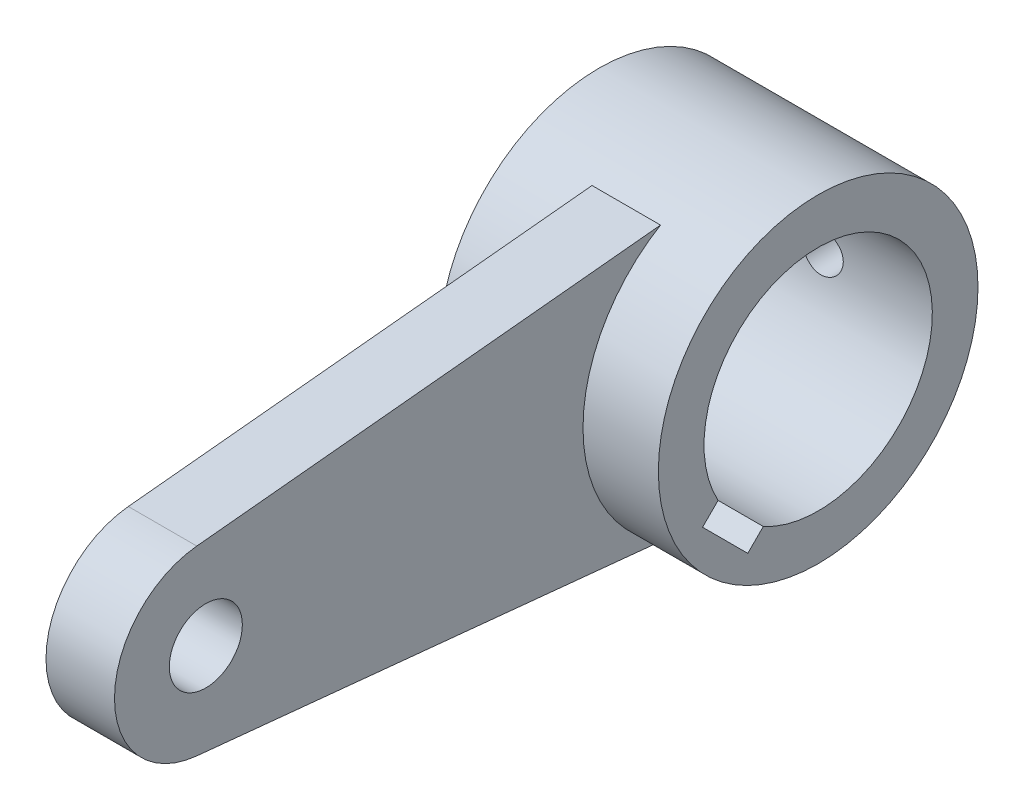
ISO-10303-21;
HEADER;
FILE_DESCRIPTION(('STEP AP214'),'2;1');
FILE_NAME('part.step','',(''),(''),'','','');
FILE_SCHEMA(('AUTOMOTIVE_DESIGN { 1 0 10303 214 1 1 1 1 }'));
ENDSEC;
DATA;
#1=APPLICATION_CONTEXT('core data for automotive mechanical design processes');
#2=APPLICATION_PROTOCOL_DEFINITION('international standard','automotive_design',2000,#1);
#3=PRODUCT_CONTEXT('',#1,'mechanical');
#4=PRODUCT('Part','Part','',(#3));
#5=PRODUCT_RELATED_PRODUCT_CATEGORY('part','',(#4));
#6=PRODUCT_DEFINITION_FORMATION('','',#4);
#7=PRODUCT_DEFINITION_CONTEXT('part definition',#1,'design');
#8=PRODUCT_DEFINITION('design','',#6,#7);
#9=PRODUCT_DEFINITION_SHAPE('','',#8);
#10=(LENGTH_UNIT() NAMED_UNIT(*) SI_UNIT(.MILLI.,.METRE.));
#11=(NAMED_UNIT(*) PLANE_ANGLE_UNIT() SI_UNIT($,.RADIAN.));
#12=(NAMED_UNIT(*) SI_UNIT($,.STERADIAN.) SOLID_ANGLE_UNIT());
#13=UNCERTAINTY_MEASURE_WITH_UNIT(LENGTH_MEASURE(1.E-05),#10,'distance_accuracy_value','');
#14=(GEOMETRIC_REPRESENTATION_CONTEXT(3) GLOBAL_UNCERTAINTY_ASSIGNED_CONTEXT((#13)) GLOBAL_UNIT_ASSIGNED_CONTEXT((#10,
#11,#12)) REPRESENTATION_CONTEXT('',''));
#15=CARTESIAN_POINT('',(0.,0.,0.));
#16=DIRECTION('',(0.,0.,1.));
#17=DIRECTION('',(1.,0.,0.));
#18=AXIS2_PLACEMENT_3D('',#15,#16,#17);
#19=CARTESIAN_POINT('',(24.,-1.66533453693773E-13,0.));
#20=DIRECTION('',(-1.,0.,0.));
#21=DIRECTION('',(0.,0.,1.00000000000001));
#22=AXIS2_PLACEMENT_3D('',#19,#20,#21);
#23=CYLINDRICAL_SURFACE('',#22,35.);
#24=DIRECTION('',(-1.,0.,0.));
#25=VECTOR('',#24,1.);
#26=CARTESIAN_POINT('',(7.50000000000006,30.0000000000002,18.0277563773201));
#27=LINE('',#26,#25);
#28=CARTESIAN_POINT('',(7.50000000000006,30.0000000000002,18.0277563773201));
#29=VERTEX_POINT('',#28);
#30=CARTESIAN_POINT('',(-7.50000000000006,30.,18.0277563773202));
#31=VERTEX_POINT('',#30);
#32=EDGE_CURVE('E63',#29,#31,#27,.T.);
#33=ORIENTED_EDGE('',*,*,#32,.F.);
#34=CARTESIAN_POINT('',(7.50000000000006,-1.11022302462516E-13,0.));
#35=DIRECTION('',(-1.,0.,0.));
#36=DIRECTION('',(0.,0.,-1.00000000000001));
#37=AXIS2_PLACEMENT_3D('',#34,#35,#36);
#38=CIRCLE('',#37,35.);
#39=CARTESIAN_POINT('',(7.50000000000006,-30.0000000000003,18.0277563773201));
#40=VERTEX_POINT('',#39);
#41=EDGE_CURVE('E145',#40,#29,#38,.T.);
#42=ORIENTED_EDGE('',*,*,#41,.F.);
#43=DIRECTION('',(-1.,0.,0.));
#44=VECTOR('',#43,1.);
#45=CARTESIAN_POINT('',(7.50000000000006,-30.0000000000003,18.0277563773201));
#46=LINE('',#45,#44);
#47=CARTESIAN_POINT('',(-7.50000000000006,-30.0000000000001,18.0277563773202));
#48=VERTEX_POINT('',#47);
#49=EDGE_CURVE('E156',#40,#48,#46,.T.);
#50=ORIENTED_EDGE('',*,*,#49,.T.);
#51=CARTESIAN_POINT('',(-7.50000000000006,0.,0.));
#52=DIRECTION('',(-1.,0.,0.));
#53=DIRECTION('',(0.,0.,-1.00000000000001));
#54=AXIS2_PLACEMENT_3D('',#51,#52,#53);
#55=CIRCLE('',#54,35.);
#56=EDGE_CURVE('E142',#48,#31,#55,.T.);
#57=ORIENTED_EDGE('',*,*,#56,.T.);
#58=EDGE_LOOP('',(#33,#42,#50,#57));
#59=FACE_BOUND('',#58,.T.);
#60=CARTESIAN_POINT('',(24.,-1.66533453693773E-13,0.));
#61=DIRECTION('',(1.,0.,0.));
#62=DIRECTION('',(0.,0.,-1.00000000000001));
#63=AXIS2_PLACEMENT_3D('',#60,#61,#62);
#64=CIRCLE('',#63,35.);
#65=CARTESIAN_POINT('',(24.,-1.65562008547226E-13,-35.0000000000002));
#66=VERTEX_POINT('',#65);
#67=EDGE_CURVE('E177',#66,#66,#64,.T.);
#68=ORIENTED_EDGE('',*,*,#67,.F.);
#69=EDGE_LOOP('',(#68));
#70=FACE_BOUND('',#69,.T.);
#71=CARTESIAN_POINT('',(-24.,0.,0.));
#72=DIRECTION('',(1.,0.,0.));
#73=DIRECTION('',(0.,0.,-1.00000000000001));
#74=AXIS2_PLACEMENT_3D('',#71,#72,#73);
#75=CIRCLE('',#74,35.);
#76=CARTESIAN_POINT('',(-24.,0.,-35.0000000000002));
#77=VERTEX_POINT('',#76);
#78=EDGE_CURVE('E175',#77,#77,#75,.T.);
#79=ORIENTED_EDGE('',*,*,#78,.T.);
#80=EDGE_LOOP('',(#79));
#81=FACE_BOUND('',#80,.T.);
#82=CARTESIAN_POINT('',(-4.49999999999995,-3.33066907387547E-13,-35.0000000000001));
#83=CARTESIAN_POINT('',(-4.49998934626575,0.251653327872403,-34.9999964079494));
#84=CARTESIAN_POINT('',(-4.47881901313681,0.503462432880817,-34.9972572476564));
#85=CARTESIAN_POINT('',(-4.39470294313481,1.00006950608812,-34.9865936899741));
#86=CARTESIAN_POINT('',(-4.33171397409341,1.24485994489291,-34.978663926651));
#87=CARTESIAN_POINT('',(-4.16585068292742,1.72016871583605,-34.9585122034243));
#88=CARTESIAN_POINT('',(-4.06300364644997,1.95069668671067,-34.9462931803585));
#89=CARTESIAN_POINT('',(-3.8204043124335,2.39117836341503,-34.9189207749941));
#90=CARTESIAN_POINT('',(-3.68065818529258,2.60113550113225,-34.9037678834205));
#91=CARTESIAN_POINT('',(-3.36735984834219,2.9957782427564,-34.8721202031521));
#92=CARTESIAN_POINT('',(-3.19363599493925,3.1803270707991,-34.8556188598466));
#93=CARTESIAN_POINT('',(-2.81768227222749,3.51773628297806,-34.8231867224519));
#94=CARTESIAN_POINT('',(-2.61545092759514,3.67059502607258,-34.8072559579451));
#95=CARTESIAN_POINT('',(-2.18732976956002,3.94079764224661,-34.7777043595065));
#96=CARTESIAN_POINT('',(-1.96135807855393,4.05801278848318,-34.7640919744397));
#97=CARTESIAN_POINT('',(-1.49273282489478,4.25277875211245,-34.7408052922164));
#98=CARTESIAN_POINT('',(-1.25007993126687,4.33033115918836,-34.7311308372308));
#99=CARTESIAN_POINT('',(-0.756402638544772,4.44315330658766,-34.716878277897));
#100=CARTESIAN_POINT('',(-0.50543194558499,4.4786544653308,-34.7122722905706));
#101=CARTESIAN_POINT('',(-0.00105596789795544,4.50708256587183,-34.7085929456662));
#102=CARTESIAN_POINT('',(0.252349212979716,4.5000113157291,-34.7095193531262));
#103=CARTESIAN_POINT('',(0.752785247513631,4.44368517865505,-34.7167746091795));
#104=CARTESIAN_POINT('',(0.999845376275211,4.39468557875236,-34.7230707625071));
#105=CARTESIAN_POINT('',(1.48220708776003,4.25629214436951,-34.7403050878774));
#106=CARTESIAN_POINT('',(1.7175084195286,4.16689744819116,-34.7512433589442));
#107=CARTESIAN_POINT('',(2.17046410907089,3.94997819255534,-34.7765663978875));
#108=CARTESIAN_POINT('',(2.38806493736818,3.82234306789773,-34.7909611352105));
#109=CARTESIAN_POINT('',(2.7988560298196,3.53264509529936,-34.8215675443457));
#110=CARTESIAN_POINT('',(2.9920451123774,3.37058058189771,-34.8377793040352));
#111=CARTESIAN_POINT('',(3.3500102646726,3.01521121875477,-34.870338327066));
#112=CARTESIAN_POINT('',(3.51456802498349,2.8216863969924,-34.8866857137117));
#113=CARTESIAN_POINT('',(3.80889828104401,2.40964625009522,-34.9175631452331));
#114=CARTESIAN_POINT('',(3.93867068845786,2.19113086150006,-34.9320931854937));
#115=CARTESIAN_POINT('',(4.15974809240745,1.73514132152119,-34.9577085505708));
#116=CARTESIAN_POINT('',(4.25103900112678,1.49766026471358,-34.9687926134493));
#117=CARTESIAN_POINT('',(4.39238652013332,1.01056525528227,-34.986255844504));
#118=CARTESIAN_POINT('',(4.44244517345161,0.760951904454844,-34.9926352457915));
#119=CARTESIAN_POINT('',(4.4996232857792,0.258565063455578,-34.9999399922945));
#120=CARTESIAN_POINT('',(4.50704339651776,0.00582632488153038,-35.0009035246809));
#121=CARTESIAN_POINT('',(4.47952782522866,-0.497291152296377,-34.9973711849401));
#122=CARTESIAN_POINT('',(4.44459309873939,-0.747669944012954,-34.9928754359761));
#123=CARTESIAN_POINT('',(4.33360932491524,-1.23806995443231,-34.9789534490072));
#124=CARTESIAN_POINT('',(4.25770404518851,-1.47812424084549,-34.9695444555461));
#125=CARTESIAN_POINT('',(4.06708358974661,-1.94209663413517,-34.9468491097887));
#126=CARTESIAN_POINT('',(3.95236702711579,-2.16601416402005,-34.9335626189329));
#127=CARTESIAN_POINT('',(3.68665590111389,-2.59269685534762,-34.9044977168871));
#128=CARTESIAN_POINT('',(3.53546735311593,-2.79534030307811,-34.8887061410242));
#129=CARTESIAN_POINT('',(3.20137779872807,-3.17248320306732,-34.8564376514751));
#130=CARTESIAN_POINT('',(3.01847545768736,-3.34698147026079,-34.8399607089677));
#131=CARTESIAN_POINT('',(2.62482397817248,-3.66395097341646,-34.8080602827341));
#132=CARTESIAN_POINT('',(2.4139134749398,-3.80622260959342,-34.7926437553188));
#133=CARTESIAN_POINT('',(1.97101366598868,-4.05332025045468,-34.7647252726913));
#134=CARTESIAN_POINT('',(1.73902480343612,-4.15814704217663,-34.752223256222));
#135=CARTESIAN_POINT('',(1.26119114696489,-4.32705800869408,-34.7315971267896));
#136=CARTESIAN_POINT('',(1.01538632144946,-4.3912537253473,-34.7234610377672));
#137=CARTESIAN_POINT('',(0.516374156230169,-4.47743895394378,-34.7124539507529));
#138=CARTESIAN_POINT('',(0.263167183151895,-4.4994305526575,-34.7095826924432));
#139=CARTESIAN_POINT('',(-0.241475469606281,-4.50054349543279,-34.7094382399855));
#140=CARTESIAN_POINT('',(-0.492910503368095,-4.47997844331771,-34.7121240949414));
#141=CARTESIAN_POINT('',(-0.988718228071383,-4.39722698982336,-34.7227030727448));
#142=CARTESIAN_POINT('',(-1.23309091964491,-4.33504059216907,-34.7305961951262));
#143=CARTESIAN_POINT('',(-1.70778976267331,-4.17091148969104,-34.750687466182));
#144=CARTESIAN_POINT('',(-1.93812153088628,-4.06898480437313,-34.7628838799905));
#145=CARTESIAN_POINT('',(-2.37846324003053,-3.82829928040281,-34.7902102580458));
#146=CARTESIAN_POINT('',(-2.58847286808922,-3.68953987480971,-34.8053402674465));
#147=CARTESIAN_POINT('',(-2.98381083182371,-3.37796728972685,-34.836962557244));
#148=CARTESIAN_POINT('',(-3.16895438482945,-3.20492053127879,-34.8534637038449));
#149=CARTESIAN_POINT('',(-3.5076938811061,-2.83017416001607,-34.8858912690296));
#150=CARTESIAN_POINT('',(-3.66128239212985,-2.62846781580981,-34.9018175514877));
#151=CARTESIAN_POINT('',(-3.93308173949245,-2.20119414278173,-34.9313720206137));
#152=CARTESIAN_POINT('',(-4.05114792210661,-1.97553418075075,-34.9449907146481));
#153=CARTESIAN_POINT('',(-4.2475391338936,-1.50753822284314,-34.9682999183416));
#154=CARTESIAN_POINT('',(-4.32590708039909,-1.26522055880244,-34.9779946678449));
#155=CARTESIAN_POINT('',(-4.42204672994424,-0.851391856056923,-34.9900428659329));
#156=CARTESIAN_POINT('',(-4.45123684801208,-0.682483721368915,-34.993758471601));
#157=CARTESIAN_POINT('',(-4.49021703046482,-0.342407755364722,-34.9987382509905));
#158=CARTESIAN_POINT('',(-4.50000724943648,-0.171239942065571,-35.0000024442458));
#159=CARTESIAN_POINT('',(-4.49999999999995,-3.33066907387547E-13,-35.0000000000001));
#160=B_SPLINE_CURVE_WITH_KNOTS('',3,(#82,#83,#84,#85,#86,#87,#88,#89,#90,#91,#92,#93,#94,#95,
#96,#97,#98,#99,#100,#101,#102,#103,#104,#105,#106,#107,#108,#109,#110,#111,#112,#113,#114,#115,
#116,#117,#118,#119,#120,#121,#122,#123,#124,#125,#126,#127,#128,#129,#130,#131,#132,#133,#134,
#135,#136,#137,#138,#139,#140,#141,#142,#143,#144,#145,#146,#147,#148,#149,#150,#151,#152,#153,
#154,#155,#156,#157,#158,#159),.UNSPECIFIED.,.T.,.F.,(4,2,2,2,2,2,2,2,2,2,2,2,2,2,2,2,2,2,2,2,2,
2,2,2,2,2,2,2,2,2,2,2,2,2,2,2,2,2,4),(0.,0.754334466877883,1.50944998270762,2.26404947944321,
3.01852286917677,3.77691090876911,4.53533821098032,5.29647290364948,6.05757708763706,
6.814472973727,7.57133671451225,8.3236247028369,9.07592873954035,9.83042926827081,
10.5849663029457,11.3450259361697,12.105087499511,12.8654270750951,13.6257289740878,
14.3806632115076,15.1355804176915,15.8878656438591,16.6401777556719,17.396583029077,
18.1530201429511,18.9140214951897,19.675006851315,20.4338939575413,21.192743539846,
21.9460210087599,22.6992984102579,23.4522724753418,24.2052581311086,24.9635616389129,
25.7220435478212,26.4835735890398,27.2442785819027,27.7575768593779,28.2708710466549),.UNSPECIFIED.);
#161=CARTESIAN_POINT('',(-4.49999999999995,-3.33066907387547E-13,-35.0000000000001));
#162=VERTEX_POINT('',#161);
#163=EDGE_CURVE('E129',#162,#162,#160,.T.);
#164=ORIENTED_EDGE('',*,*,#163,.F.);
#165=EDGE_LOOP('',(#164));
#166=FACE_BOUND('',#165,.T.);
#167=ADVANCED_FACE('F34',(#59,#70,#81,#166),#23,.T.);
#168=CARTESIAN_POINT('',(24.,-1.66533453693773E-13,0.));
#169=DIRECTION('',(-1.,0.,0.));
#170=DIRECTION('',(0.,0.,1.00000000000001));
#171=AXIS2_PLACEMENT_3D('',#168,#169,#170);
#172=CYLINDRICAL_SURFACE('',#171,25.);
#173=DIRECTION('',(-1.,0.,0.));
#174=VECTOR('',#173,1.);
#175=CARTESIAN_POINT('',(24.,-21.920310216783,12.0208152801715));
#176=LINE('',#175,#174);
#177=CARTESIAN_POINT('',(24.,-21.920310216783,12.0208152801715));
#178=VERTEX_POINT('',#177);
#179=CARTESIAN_POINT('',(-24.,-21.920310216783,12.0208152801715));
#180=VERTEX_POINT('',#179);
#181=EDGE_CURVE('E11',#178,#180,#176,.T.);
#182=ORIENTED_EDGE('',*,*,#181,.F.);
#183=CARTESIAN_POINT('',(24.,-1.66533453693773E-13,0.));
#184=DIRECTION('',(1.,0.,0.));
#185=DIRECTION('',(0.,0.,-1.00000000000001));
#186=AXIS2_PLACEMENT_3D('',#183,#184,#185);
#187=CIRCLE('',#186,25.);
#188=CARTESIAN_POINT('',(24.,-12.0208152801716,21.9203102167833));
#189=VERTEX_POINT('',#188);
#190=EDGE_CURVE('E172',#178,#189,#187,.T.);
#191=ORIENTED_EDGE('',*,*,#190,.T.);
#192=DIRECTION('',(-1.,0.,0.));
#193=VECTOR('',#192,1.);
#194=CARTESIAN_POINT('',(24.,-12.0208152801716,21.9203102167831));
#195=LINE('',#194,#193);
#196=CARTESIAN_POINT('',(-24.,-12.0208152801716,21.920310216783));
#197=VERTEX_POINT('',#196);
#198=EDGE_CURVE('E48',#197,#189,#195,.F.);
#199=ORIENTED_EDGE('',*,*,#198,.F.);
#200=CARTESIAN_POINT('',(-24.,0.,0.));
#201=DIRECTION('',(1.,0.,0.));
#202=DIRECTION('',(0.,0.,-1.00000000000001));
#203=AXIS2_PLACEMENT_3D('',#200,#201,#202);
#204=CIRCLE('',#203,25.);
#205=EDGE_CURVE('E123',#180,#197,#204,.T.);
#206=ORIENTED_EDGE('',*,*,#205,.F.);
#207=EDGE_LOOP('',(#182,#191,#199,#206));
#208=FACE_BOUND('',#207,.T.);
#209=CARTESIAN_POINT('',(-4.49999999999995,-1.11022302462516E-13,-25.0000000000002));
#210=CARTESIAN_POINT('',(-4.49999023794716,0.250597363973489,-24.9999955349826));
#211=CARTESIAN_POINT('',(-4.47899625537841,0.501323876917068,-24.9961930246658));
#212=CARTESIAN_POINT('',(-4.39562192968992,0.995723957330716,-24.9813904308184));
#213=CARTESIAN_POINT('',(-4.3332054899994,1.2393911797038,-24.9703840697864));
#214=CARTESIAN_POINT('',(-4.16894916310296,1.71244999616215,-24.9424062116719));
#215=CARTESIAN_POINT('',(-4.06714363575237,1.94185383059238,-24.9254399147402));
#216=CARTESIAN_POINT('',(-3.82709380352831,2.38030017518667,-24.8873996423389));
#217=CARTESIAN_POINT('',(-3.6888528990225,2.58934458292242,-24.8663260502345));
#218=CARTESIAN_POINT('',(-3.37822968752513,2.9834778410402,-24.822139967987));
#219=CARTESIAN_POINT('',(-3.20552232290175,3.16830850004184,-24.7990093268507));
#220=CARTESIAN_POINT('',(-2.83156816138718,3.50653520488889,-24.7534523836024));
#221=CARTESIAN_POINT('',(-2.63031941200503,3.65992909841612,-24.7310261298053));
#222=CARTESIAN_POINT('',(-2.20318937983305,3.93198738992529,-24.6892410288133));
#223=CARTESIAN_POINT('',(-1.97714004226102,4.05039185622169,-24.6699056064478));
#224=CARTESIAN_POINT('',(-1.50795273724956,4.2474469178391,-24.6367457883013));
#225=CARTESIAN_POINT('',(-1.26481612489629,4.32610066150116,-24.6229209560884));
#226=CARTESIAN_POINT('',(-0.771109385193369,4.44059853206696,-24.6025296249145));
#227=CARTESIAN_POINT('',(-0.520646504029415,4.47689129643552,-24.5958871157589));
#228=CARTESIAN_POINT('',(-0.0171050046734491,4.50702896793608,-24.5903830912277));
#229=CARTESIAN_POINT('',(0.235973395787819,4.50087738040679,-24.5915209332985));
#230=CARTESIAN_POINT('',(0.734329570898128,4.44666536597973,-24.6013797705315));
#231=CARTESIAN_POINT('',(0.979664673316047,4.39911277131175,-24.6100088728768));
#232=CARTESIAN_POINT('',(1.45881687055286,4.26424730205563,-24.63373379911));
#233=CARTESIAN_POINT('',(1.69263351048957,4.17693285860228,-24.648829878161));
#234=CARTESIAN_POINT('',(2.1436102862432,3.96451882360117,-24.6838850704584));
#235=CARTESIAN_POINT('',(2.36067067050965,3.83921201164635,-24.7038707343534));
#236=CARTESIAN_POINT('',(2.7708760062849,3.55451700057589,-24.7464353447751));
#237=CARTESIAN_POINT('',(2.9640187125665,3.39512560565782,-24.7690145343812));
#238=CARTESIAN_POINT('',(3.32384227379375,3.04403715860629,-24.8146237678445));
#239=CARTESIAN_POINT('',(3.49009887265454,2.85190522880319,-24.8376556021254));
#240=CARTESIAN_POINT('',(3.78808180669693,2.44225060557953,-24.881273529755));
#241=CARTESIAN_POINT('',(3.91980784519202,2.22472769402289,-24.9018596020889));
#242=CARTESIAN_POINT('',(4.1450439712581,1.77003953774171,-24.9383032656861));
#243=CARTESIAN_POINT('',(4.23851241690934,1.53285322593546,-24.9541556995184));
#244=CARTESIAN_POINT('',(4.38416438602455,1.04579850607948,-24.9793055791381));
#245=CARTESIAN_POINT('',(4.4363519462577,0.795931340606729,-24.9886036658513));
#246=CARTESIAN_POINT('',(4.49737595980626,0.294260216988724,-24.9995098648127));
#247=CARTESIAN_POINT('',(4.50679412042046,0.0425291868627092,-25.0012211575047));
#248=CARTESIAN_POINT('',(4.48356880794404,-0.458911723409027,-24.9970450682725));
#249=CARTESIAN_POINT('',(4.45092723320145,-0.708621694262514,-24.9911580292957));
#250=CARTESIAN_POINT('',(4.34499276666361,-1.19710504925384,-24.9725108511796));
#251=CARTESIAN_POINT('',(4.27199185315775,-1.4359438019482,-24.9598000968948));
#252=CARTESIAN_POINT('',(4.08772514305916,-1.89799257184644,-24.9289247642722));
#253=CARTESIAN_POINT('',(3.97645691054887,-2.12120159304621,-24.9107598387569));
#254=CARTESIAN_POINT('',(3.71750990184805,-2.5481539388493,-24.8707339593879));
#255=CARTESIAN_POINT('',(3.56947271887181,-2.75167647822452,-24.8488373327329));
#256=CARTESIAN_POINT('',(3.24167799765413,-3.13119917221319,-24.8038743164273));
#257=CARTESIAN_POINT('',(3.06191774493277,-3.30719696915644,-24.7808078267942));
#258=CARTESIAN_POINT('',(2.67315500182619,-3.6288645722753,-24.7357657200146));
#259=CARTESIAN_POINT('',(2.46382297755334,-3.77413883025351,-24.7138068137445));
#260=CARTESIAN_POINT('',(2.02338469814568,-4.02746147197321,-24.6737931763475));
#261=CARTESIAN_POINT('',(1.7922792114903,-4.13551116890376,-24.6557383075042));
#262=CARTESIAN_POINT('',(1.31589632776001,-4.31074517708681,-24.6257060037151));
#263=CARTESIAN_POINT('',(1.07068958451147,-4.37811658335161,-24.6137007869682));
#264=CARTESIAN_POINT('',(0.572202641973238,-4.47066328367804,-24.5970611969283));
#265=CARTESIAN_POINT('',(0.318923277225447,-4.49584292516916,-24.5924260642261));
#266=CARTESIAN_POINT('',(-0.184561947418738,-4.50315482558987,-24.5910878378628));
#267=CARTESIAN_POINT('',(-0.434758663309434,-4.48591048444913,-24.5942698737029));
#268=CARTESIAN_POINT('',(-0.928626221595395,-4.41022247631839,-24.6079538411192));
#269=CARTESIAN_POINT('',(-1.17229709592798,-4.35177901099423,-24.6184557368654));
#270=CARTESIAN_POINT('',(-1.64589578423666,-4.19560591177263,-24.6455494917391));
#271=CARTESIAN_POINT('',(-1.87584475423249,-4.09793864892318,-24.662131678772));
#272=CARTESIAN_POINT('',(-2.3161932333367,-3.86615687487567,-24.6995253290601));
#273=CARTESIAN_POINT('',(-2.52659151135304,-3.73204007056224,-24.7203370583837));
#274=CARTESIAN_POINT('',(-2.92499910875624,-3.42897741943998,-24.7642042764879));
#275=CARTESIAN_POINT('',(-3.11265894808348,-3.25957598277677,-24.7872867920529));
#276=CARTESIAN_POINT('',(-3.45709859905695,-2.89170727952956,-24.8328876755422));
#277=CARTESIAN_POINT('',(-3.61387129988854,-2.69323333818789,-24.8554059125196));
#278=CARTESIAN_POINT('',(-3.89327881529932,-2.2709082423887,-24.8975568201724));
#279=CARTESIAN_POINT('',(-4.01562311176304,-2.04686231241929,-24.9171643109946));
#280=CARTESIAN_POINT('',(-4.2207428100312,-1.58112288437946,-24.951039224399));
#281=CARTESIAN_POINT('',(-4.30355622072265,-1.33944659673398,-24.9653117736426));
#282=CARTESIAN_POINT('',(-4.41001277594747,-0.914142661867373,-24.9839218868528));
#283=CARTESIAN_POINT('',(-4.4437016877149,-0.733035393798858,-24.9899178167023));
#284=CARTESIAN_POINT('',(-4.48869863631088,-0.367975256206782,-24.9979584689488));
#285=CARTESIAN_POINT('',(-4.50000716861832,-0.184022449771424,-25.0000032788195));
#286=CARTESIAN_POINT('',(-4.49999999999995,-1.11022302462516E-13,-25.0000000000002));
#287=B_SPLINE_CURVE_WITH_KNOTS('',3,(#209,#210,#211,#212,#213,#214,#215,#216,#217,#218,#219,
#220,#221,#222,#223,#224,#225,#226,#227,#228,#229,#230,#231,#232,#233,#234,#235,#236,#237,#238,
#239,#240,#241,#242,#243,#244,#245,#246,#247,#248,#249,#250,#251,#252,#253,#254,#255,#256,#257,
#258,#259,#260,#261,#262,#263,#264,#265,#266,#267,#268,#269,#270,#271,#272,#273,#274,#275,#276,
#277,#278,#279,#280,#281,#282,#283,#284,#285,#286),.UNSPECIFIED.,.T.,.F.,(4,2,2,2,2,2,2,2,2,2,2,
2,2,2,2,2,2,2,2,2,2,2,2,2,2,2,2,2,2,2,2,2,2,2,2,2,2,2,4),(0.,0.751119234214514,1.50289387360229,
2.2540141987676,3.00506444969107,3.76356460982709,4.5221166833416,5.28616990310782,
6.05016259876062,6.80598838145023,7.5617517437344,8.3083733411706,9.05502440026878,
9.80582347634755,10.5566929789409,11.3184489414851,12.0802114488208,12.8428009144685,
13.6053157989071,14.3574280220778,15.1095063001764,15.8562135718352,16.6029683841675,
17.3573093811479,18.1117149569107,18.8753101422377,19.6388783870847,20.3989073934056,
21.1588580817002,21.9077085429233,22.6565553386193,23.4042160535923,24.1519238163262,
24.9099617237504,25.6681739427109,26.4326044530478,27.1962984767002,27.7478839346367,
28.2994571808942),.UNSPECIFIED.);
#288=CARTESIAN_POINT('',(-4.49999999999995,-1.11022302462516E-13,-25.0000000000002));
#289=VERTEX_POINT('',#288);
#290=EDGE_CURVE('E38',#289,#289,#287,.T.);
#291=ORIENTED_EDGE('',*,*,#290,.T.);
#292=EDGE_LOOP('',(#291));
#293=FACE_BOUND('',#292,.T.);
#294=ADVANCED_FACE('F189',(#208,#293),#172,.F.);
#295=CARTESIAN_POINT('',(24.,-1.66533453693773E-13,0.));
#296=DIRECTION('',(1.,0.,0.));
#297=DIRECTION('',(0.,0.,-1.00000000000001));
#298=AXIS2_PLACEMENT_3D('',#295,#296,#297);
#299=PLANE('',#298);
#300=DIRECTION('',(0.,0.707106781186555,-0.707106781186551));
#301=VECTOR('',#300,1.);
#302=CARTESIAN_POINT('',(24.,-3.70285616152577,-6.19663877508594));
#303=LINE('',#302,#301);
#304=CARTESIAN_POINT('',(24.,-25.3144227664789,15.4149278298669));
#305=VERTEX_POINT('',#304);
#306=EDGE_CURVE('E124',#305,#178,#303,.T.);
#307=ORIENTED_EDGE('',*,*,#306,.F.);
#308=DIRECTION('',(0.,-0.707106781186552,-0.707106781186554));
#309=VECTOR('',#308,1.);
#310=CARTESIAN_POINT('',(24.,-15.4149278298668,25.3144227664786));
#311=LINE('',#310,#309);
#312=CARTESIAN_POINT('',(24.,-15.4149278298668,25.3144227664786));
#313=VERTEX_POINT('',#312);
#314=EDGE_CURVE('E126',#313,#305,#311,.T.);
#315=ORIENTED_EDGE('',*,*,#314,.F.);
#316=DIRECTION('',(0.,-0.707106781186555,0.707106781186552));
#317=VECTOR('',#316,1.);
#318=CARTESIAN_POINT('',(24.,6.19663877508581,3.70285616152587));
#319=LINE('',#318,#317);
#320=EDGE_CURVE('E106',#189,#313,#319,.T.);
#321=ORIENTED_EDGE('',*,*,#320,.F.);
#322=ORIENTED_EDGE('',*,*,#190,.F.);
#323=EDGE_LOOP('',(#307,#315,#321,#322));
#324=FACE_BOUND('',#323,.T.);
#325=ORIENTED_EDGE('',*,*,#67,.T.);
#326=EDGE_LOOP('',(#325));
#327=FACE_BOUND('',#326,.T.);
#328=ADVANCED_FACE('F186',(#324,#327),#299,.T.);
#329=CARTESIAN_POINT('',(-24.,0.,0.));
#330=DIRECTION('',(1.,0.,0.));
#331=DIRECTION('',(0.,0.,-1.00000000000001));
#332=AXIS2_PLACEMENT_3D('',#329,#330,#331);
#333=PLANE('',#332);
#334=ORIENTED_EDGE('',*,*,#78,.F.);
#335=EDGE_LOOP('',(#334));
#336=FACE_BOUND('',#335,.T.);
#337=DIRECTION('',(0.,-0.707106781186552,-0.707106781186554));
#338=VECTOR('',#337,1.);
#339=CARTESIAN_POINT('',(-24.,-15.414927829867,25.3144227664786));
#340=LINE('',#339,#338);
#341=CARTESIAN_POINT('',(-24.,-15.414927829867,25.3144227664786));
#342=VERTEX_POINT('',#341);
#343=CARTESIAN_POINT('',(-24.,-25.3144227664787,15.4149278298668));
#344=VERTEX_POINT('',#343);
#345=EDGE_CURVE('E114',#342,#344,#340,.T.);
#346=ORIENTED_EDGE('',*,*,#345,.T.);
#347=DIRECTION('',(0.,0.707106781186555,-0.707106781186551));
#348=VECTOR('',#347,1.);
#349=CARTESIAN_POINT('',(-24.,-3.7028561615256,-6.19663877508588));
#350=LINE('',#349,#348);
#351=EDGE_CURVE('E111',#344,#180,#350,.T.);
#352=ORIENTED_EDGE('',*,*,#351,.T.);
#353=ORIENTED_EDGE('',*,*,#205,.T.);
#354=DIRECTION('',(0.,-0.707106781186555,0.707106781186552));
#355=VECTOR('',#354,1.);
#356=CARTESIAN_POINT('',(-24.,6.19663877508603,3.70285616152564));
#357=LINE('',#356,#355);
#358=EDGE_CURVE('E55',#197,#342,#357,.T.);
#359=ORIENTED_EDGE('',*,*,#358,.T.);
#360=EDGE_LOOP('',(#346,#352,#353,#359));
#361=FACE_BOUND('',#360,.T.);
#362=ADVANCED_FACE('F121',(#336,#361),#333,.F.);
#363=CARTESIAN_POINT('',(7.50000000000006,30.0000000000002,18.0277563773201));
#364=DIRECTION('',(0.,-0.995092310823561,-0.0989509622987186));
#365=DIRECTION('',(0.,0.0989509622987189,-0.995092310823561));
#366=AXIS2_PLACEMENT_3D('',#363,#364,#365);
#367=PLANE('',#366);
#368=DIRECTION('',(0.,-0.0989509622987186,0.995092310823561));
#369=VECTOR('',#368,1.);
#370=CARTESIAN_POINT('',(-7.50000000000006,30.,18.0277563773202));
#371=LINE('',#370,#369);
#372=CARTESIAN_POINT('',(-7.50000000000006,19.9018462164712,119.579019245975));
#373=VERTEX_POINT('',#372);
#374=EDGE_CURVE('E158',#31,#373,#371,.T.);
#375=ORIENTED_EDGE('',*,*,#374,.T.);
#376=DIRECTION('',(-1.,0.,0.));
#377=VECTOR('',#376,1.);
#378=CARTESIAN_POINT('',(7.50000000000006,19.9018462164712,119.579019245975));
#379=LINE('',#378,#377);
#380=CARTESIAN_POINT('',(7.50000000000006,19.9018462164712,119.579019245975));
#381=VERTEX_POINT('',#380);
#382=EDGE_CURVE('E168',#381,#373,#379,.T.);
#383=ORIENTED_EDGE('',*,*,#382,.F.);
#384=DIRECTION('',(0.,-0.0989509622987186,0.995092310823561));
#385=VECTOR('',#384,1.);
#386=CARTESIAN_POINT('',(7.50000000000006,30.0000000000002,18.0277563773201));
#387=LINE('',#386,#385);
#388=EDGE_CURVE('E148',#29,#381,#387,.T.);
#389=ORIENTED_EDGE('',*,*,#388,.F.);
#390=ORIENTED_EDGE('',*,*,#32,.T.);
#391=EDGE_LOOP('',(#375,#383,#389,#390));
#392=FACE_BOUND('',#391,.T.);
#393=ADVANCED_FACE('F244',(#392),#367,.F.);
#394=CARTESIAN_POINT('',(7.49999999999984,1.11022302462516E-13,117.600000000001));
#395=DIRECTION('',(-1.,0.,0.));
#396=DIRECTION('',(0.,0.,1.00000000000001));
#397=AXIS2_PLACEMENT_3D('',#394,#395,#396);
#398=CYLINDRICAL_SURFACE('',#397,20.);
#399=CARTESIAN_POINT('',(-7.50000000000028,1.11022302462516E-13,117.600000000001));
#400=DIRECTION('',(1.,0.,0.));
#401=DIRECTION('',(0.,0.,-1.00000000000001));
#402=AXIS2_PLACEMENT_3D('',#399,#400,#401);
#403=CIRCLE('',#402,20.);
#404=CARTESIAN_POINT('',(-7.50000000000006,-19.9018462164712,119.579019245975));
#405=VERTEX_POINT('',#404);
#406=EDGE_CURVE('E160',#373,#405,#403,.T.);
#407=ORIENTED_EDGE('',*,*,#406,.T.);
#408=DIRECTION('',(-1.,0.,0.));
#409=VECTOR('',#408,1.);
#410=CARTESIAN_POINT('',(7.50000000000006,-19.9018462164711,119.579019245975));
#411=LINE('',#410,#409);
#412=CARTESIAN_POINT('',(7.50000000000006,-19.9018462164711,119.579019245975));
#413=VERTEX_POINT('',#412);
#414=EDGE_CURVE('E165',#413,#405,#411,.T.);
#415=ORIENTED_EDGE('',*,*,#414,.F.);
#416=CARTESIAN_POINT('',(7.49999999999984,1.11022302462516E-13,117.600000000001));
#417=DIRECTION('',(1.,0.,0.));
#418=DIRECTION('',(0.,0.,-1.00000000000001));
#419=AXIS2_PLACEMENT_3D('',#416,#417,#418);
#420=CIRCLE('',#419,20.);
#421=EDGE_CURVE('E151',#381,#413,#420,.T.);
#422=ORIENTED_EDGE('',*,*,#421,.F.);
#423=ORIENTED_EDGE('',*,*,#382,.T.);
#424=EDGE_LOOP('',(#407,#415,#422,#423));
#425=FACE_BOUND('',#424,.T.);
#426=ADVANCED_FACE('F240',(#425),#398,.T.);
#427=CARTESIAN_POINT('',(7.50000000000006,-19.9018462164711,119.579019245975));
#428=DIRECTION('',(0.,0.99509231082356,-0.0989509622987187));
#429=DIRECTION('',(0.,0.0989509622987185,0.995092310823561));
#430=AXIS2_PLACEMENT_3D('',#427,#428,#429);
#431=PLANE('',#430);
#432=DIRECTION('',(0.,-0.0989509622987187,-0.99509231082356));
#433=VECTOR('',#432,1.);
#434=CARTESIAN_POINT('',(-7.50000000000006,-19.9018462164712,119.579019245975));
#435=LINE('',#434,#433);
#436=EDGE_CURVE('E149',#405,#48,#435,.T.);
#437=ORIENTED_EDGE('',*,*,#436,.T.);
#438=ORIENTED_EDGE('',*,*,#49,.F.);
#439=DIRECTION('',(0.,-0.0989509622987187,-0.99509231082356));
#440=VECTOR('',#439,1.);
#441=CARTESIAN_POINT('',(7.50000000000006,-19.9018462164711,119.579019245975));
#442=LINE('',#441,#440);
#443=EDGE_CURVE('E153',#413,#40,#442,.T.);
#444=ORIENTED_EDGE('',*,*,#443,.F.);
#445=ORIENTED_EDGE('',*,*,#414,.T.);
#446=EDGE_LOOP('',(#437,#438,#444,#445));
#447=FACE_BOUND('',#446,.T.);
#448=ADVANCED_FACE('F233',(#447),#431,.F.);
#449=CARTESIAN_POINT('',(7.50000000000006,-1.11022302462516E-13,0.));
#450=DIRECTION('',(1.,0.,0.));
#451=DIRECTION('',(0.,0.,-1.00000000000001));
#452=AXIS2_PLACEMENT_3D('',#449,#450,#451);
#453=PLANE('',#452);
#454=CARTESIAN_POINT('',(7.49999999999984,1.11022302462516E-13,117.600000000001));
#455=DIRECTION('',(1.,0.,0.));
#456=DIRECTION('',(0.,0.,-1.00000000000001));
#457=AXIS2_PLACEMENT_3D('',#454,#455,#456);
#458=CIRCLE('',#457,8.);
#459=CARTESIAN_POINT('',(7.49999999999984,1.11244347067441E-13,109.600000000001));
#460=VERTEX_POINT('',#459);
#461=EDGE_CURVE('E137',#460,#460,#458,.T.);
#462=ORIENTED_EDGE('',*,*,#461,.F.);
#463=EDGE_LOOP('',(#462));
#464=FACE_BOUND('',#463,.T.);
#465=ORIENTED_EDGE('',*,*,#41,.T.);
#466=ORIENTED_EDGE('',*,*,#388,.T.);
#467=ORIENTED_EDGE('',*,*,#421,.T.);
#468=ORIENTED_EDGE('',*,*,#443,.T.);
#469=EDGE_LOOP('',(#465,#466,#467,#468));
#470=FACE_BOUND('',#469,.T.);
#471=ADVANCED_FACE('F230',(#464,#470),#453,.T.);
#472=CARTESIAN_POINT('',(-7.50000000000006,0.,0.));
#473=DIRECTION('',(1.,0.,0.));
#474=DIRECTION('',(0.,0.,-1.00000000000001));
#475=AXIS2_PLACEMENT_3D('',#472,#473,#474);
#476=PLANE('',#475);
#477=CARTESIAN_POINT('',(-7.50000000000028,1.11022302462516E-13,117.600000000001));
#478=DIRECTION('',(1.,0.,0.));
#479=DIRECTION('',(0.,0.,-1.00000000000001));
#480=AXIS2_PLACEMENT_3D('',#477,#478,#479);
#481=CIRCLE('',#480,8.);
#482=CARTESIAN_POINT('',(-7.50000000000028,1.11244347067441E-13,109.600000000001));
#483=VERTEX_POINT('',#482);
#484=EDGE_CURVE('E139',#483,#483,#481,.T.);
#485=ORIENTED_EDGE('',*,*,#484,.T.);
#486=EDGE_LOOP('',(#485));
#487=FACE_BOUND('',#486,.T.);
#488=ORIENTED_EDGE('',*,*,#56,.F.);
#489=ORIENTED_EDGE('',*,*,#436,.F.);
#490=ORIENTED_EDGE('',*,*,#406,.F.);
#491=ORIENTED_EDGE('',*,*,#374,.F.);
#492=EDGE_LOOP('',(#488,#489,#490,#491));
#493=FACE_BOUND('',#492,.T.);
#494=ADVANCED_FACE('F201',(#487,#493),#476,.F.);
#495=CARTESIAN_POINT('',(-7.50000000000028,1.11022302462516E-13,117.600000000001));
#496=DIRECTION('',(1.,0.,0.));
#497=DIRECTION('',(0.,0.,-1.00000000000001));
#498=AXIS2_PLACEMENT_3D('',#495,#496,#497);
#499=CYLINDRICAL_SURFACE('',#498,8.);
#500=ORIENTED_EDGE('',*,*,#484,.F.);
#501=EDGE_LOOP('',(#500));
#502=FACE_BOUND('',#501,.T.);
#503=ORIENTED_EDGE('',*,*,#461,.T.);
#504=EDGE_LOOP('',(#503));
#505=FACE_BOUND('',#504,.T.);
#506=ADVANCED_FACE('F194',(#502,#505),#499,.F.);
#507=CARTESIAN_POINT('',(-24.,-3.7028561615256,-6.19663877508588));
#508=DIRECTION('',(0.,-0.707106781186551,-0.707106781186555));
#509=DIRECTION('',(0.,0.707106781186555,-0.707106781186551));
#510=AXIS2_PLACEMENT_3D('',#507,#508,#509);
#511=PLANE('',#510);
#512=ORIENTED_EDGE('',*,*,#181,.T.);
#513=ORIENTED_EDGE('',*,*,#351,.F.);
#514=DIRECTION('',(1.,0.,0.));
#515=VECTOR('',#514,1.);
#516=CARTESIAN_POINT('',(-24.,-25.3144227664787,15.4149278298668));
#517=LINE('',#516,#515);
#518=EDGE_CURVE('E110',#344,#305,#517,.T.);
#519=ORIENTED_EDGE('',*,*,#518,.T.);
#520=ORIENTED_EDGE('',*,*,#306,.T.);
#521=EDGE_LOOP('',(#512,#513,#519,#520));
#522=FACE_BOUND('',#521,.T.);
#523=ADVANCED_FACE('F192',(#522),#511,.F.);
#524=CARTESIAN_POINT('',(-24.,-15.414927829867,25.3144227664786));
#525=DIRECTION('',(0.,-0.707106781186555,0.707106781186552));
#526=DIRECTION('',(0.,-0.707106781186552,-0.707106781186555));
#527=AXIS2_PLACEMENT_3D('',#524,#525,#526);
#528=PLANE('',#527);
#529=ORIENTED_EDGE('',*,*,#314,.T.);
#530=ORIENTED_EDGE('',*,*,#518,.F.);
#531=ORIENTED_EDGE('',*,*,#345,.F.);
#532=DIRECTION('',(1.,0.,0.));
#533=VECTOR('',#532,1.);
#534=CARTESIAN_POINT('',(-24.,-15.414927829867,25.3144227664786));
#535=LINE('',#534,#533);
#536=EDGE_CURVE('E102',#342,#313,#535,.T.);
#537=ORIENTED_EDGE('',*,*,#536,.T.);
#538=EDGE_LOOP('',(#529,#530,#531,#537));
#539=FACE_BOUND('',#538,.T.);
#540=ADVANCED_FACE('F115',(#539),#528,.F.);
#541=CARTESIAN_POINT('',(-24.,6.19663877508603,3.70285616152564));
#542=DIRECTION('',(0.,0.707106781186552,0.707106781186554));
#543=DIRECTION('',(0.,-0.707106781186555,0.707106781186552));
#544=AXIS2_PLACEMENT_3D('',#541,#542,#543);
#545=PLANE('',#544);
#546=ORIENTED_EDGE('',*,*,#198,.T.);
#547=ORIENTED_EDGE('',*,*,#320,.T.);
#548=ORIENTED_EDGE('',*,*,#536,.F.);
#549=ORIENTED_EDGE('',*,*,#358,.F.);
#550=EDGE_LOOP('',(#546,#547,#548,#549));
#551=FACE_BOUND('',#550,.T.);
#552=ADVANCED_FACE('F104',(#551),#545,.F.);
#553=CARTESIAN_POINT('',(0.,-1.11022302462516E-13,-11.));
#554=DIRECTION('',(0.,0.,-1.00000000000001));
#555=DIRECTION('',(-1.,0.,0.));
#556=AXIS2_PLACEMENT_3D('',#553,#554,#555);
#557=CYLINDRICAL_SURFACE('',#556,4.5);
#558=ORIENTED_EDGE('',*,*,#290,.F.);
#559=EDGE_LOOP('',(#558));
#560=FACE_BOUND('',#559,.T.);
#561=ORIENTED_EDGE('',*,*,#163,.T.);
#562=EDGE_LOOP('',(#561));
#563=FACE_BOUND('',#562,.T.);
#564=ADVANCED_FACE('F219',(#560,#563),#557,.F.);
#565=CLOSED_SHELL('',(#167,#294,#328,#362,#393,#426,#448,#471,#494,#506,#523,#540,#552,#564));
#566=MANIFOLD_SOLID_BREP('B2',#565);
#567=ADVANCED_BREP_SHAPE_REPRESENTATION('',(#18,#566),#14);
#568=SHAPE_DEFINITION_REPRESENTATION(#9,#567);
ENDSEC;
END-ISO-10303-21;
